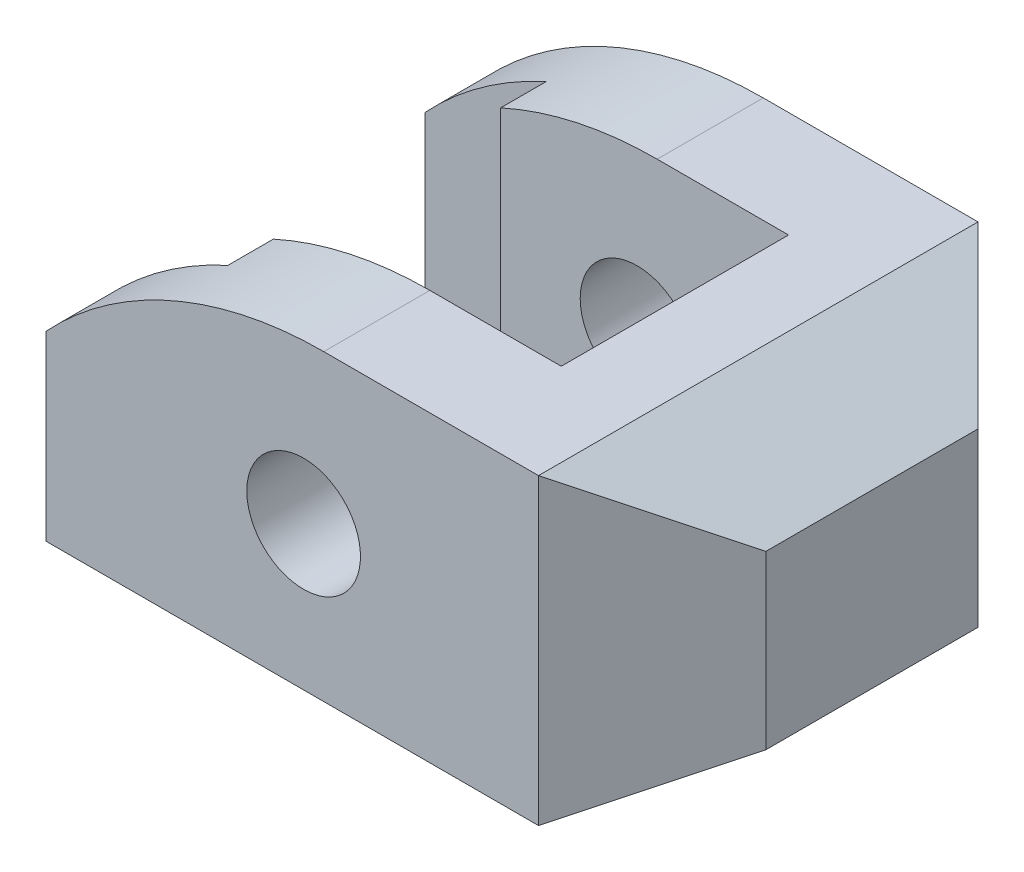
ISO-10303-21;
HEADER;
FILE_DESCRIPTION(('STEP AP214'),'2;1');
FILE_NAME('part.step','',(''),(''),'','','');
FILE_SCHEMA(('AUTOMOTIVE_DESIGN { 1 0 10303 214 1 1 1 1 }'));
ENDSEC;
DATA;
#1=APPLICATION_CONTEXT('core data for automotive mechanical design processes');
#2=APPLICATION_PROTOCOL_DEFINITION('international standard','automotive_design',2000,#1);
#3=PRODUCT_CONTEXT('',#1,'mechanical');
#4=PRODUCT('Part','Part','',(#3));
#5=PRODUCT_RELATED_PRODUCT_CATEGORY('part','',(#4));
#6=PRODUCT_DEFINITION_FORMATION('','',#4);
#7=PRODUCT_DEFINITION_CONTEXT('part definition',#1,'design');
#8=PRODUCT_DEFINITION('design','',#6,#7);
#9=PRODUCT_DEFINITION_SHAPE('','',#8);
#10=(LENGTH_UNIT() NAMED_UNIT(*) SI_UNIT(.MILLI.,.METRE.));
#11=(NAMED_UNIT(*) PLANE_ANGLE_UNIT() SI_UNIT($,.RADIAN.));
#12=(NAMED_UNIT(*) SI_UNIT($,.STERADIAN.) SOLID_ANGLE_UNIT());
#13=UNCERTAINTY_MEASURE_WITH_UNIT(LENGTH_MEASURE(1.E-05),#10,'distance_accuracy_value','');
#14=(GEOMETRIC_REPRESENTATION_CONTEXT(3) GLOBAL_UNCERTAINTY_ASSIGNED_CONTEXT((#13)) GLOBAL_UNIT_ASSIGNED_CONTEXT((#10,
#11,#12)) REPRESENTATION_CONTEXT('',''));
#15=CARTESIAN_POINT('',(0.,0.,0.));
#16=DIRECTION('',(0.,0.,1.));
#17=DIRECTION('',(1.,0.,0.));
#18=AXIS2_PLACEMENT_3D('',#15,#16,#17);
#19=CARTESIAN_POINT('',(36.6606055596467,-10.,58.));
#20=DIRECTION('',(0.,0.,1.));
#21=DIRECTION('',(1.,0.,0.));
#22=AXIS2_PLACEMENT_3D('',#19,#20,#21);
#23=PLANE('',#22);
#24=CARTESIAN_POINT('',(34.,19.,58.));
#25=DIRECTION('',(0.,0.,1.));
#26=DIRECTION('',(1.,0.,0.));
#27=AXIS2_PLACEMENT_3D('',#24,#25,#26);
#28=CIRCLE('',#27,7.5);
#29=CARTESIAN_POINT('',(26.5,19.,58.));
#30=VERTEX_POINT('',#29);
#31=EDGE_CURVE('E242',#30,#30,#28,.T.);
#32=ORIENTED_EDGE('',*,*,#31,.F.);
#33=EDGE_LOOP('',(#32));
#34=FACE_BOUND('',#33,.T.);
#35=DIRECTION('',(1.,0.,0.));
#36=VECTOR('',#35,1.);
#37=CARTESIAN_POINT('',(0.,0.,58.));
#38=LINE('',#37,#36);
#39=CARTESIAN_POINT('',(0.,0.,58.));
#40=VERTEX_POINT('',#39);
#41=CARTESIAN_POINT('',(65.,0.,58.));
#42=VERTEX_POINT('',#41);
#43=EDGE_CURVE('E222',#40,#42,#38,.T.);
#44=ORIENTED_EDGE('',*,*,#43,.T.);
#45=DIRECTION('',(0.,-1.,0.));
#46=VECTOR('',#45,1.);
#47=CARTESIAN_POINT('',(65.,40.,58.));
#48=LINE('',#47,#46);
#49=CARTESIAN_POINT('',(65.,40.,58.));
#50=VERTEX_POINT('',#49);
#51=EDGE_CURVE('E212',#50,#42,#48,.T.);
#52=ORIENTED_EDGE('',*,*,#51,.F.);
#53=DIRECTION('',(-1.,0.,0.));
#54=VECTOR('',#53,1.);
#55=CARTESIAN_POINT('',(65.,40.,58.));
#56=LINE('',#55,#54);
#57=CARTESIAN_POINT('',(36.6606055596467,40.,58.));
#58=VERTEX_POINT('',#57);
#59=EDGE_CURVE('E219',#50,#58,#56,.T.);
#60=ORIENTED_EDGE('',*,*,#59,.T.);
#61=CARTESIAN_POINT('',(36.6606055596467,-10.,58.));
#62=DIRECTION('',(0.,0.,1.));
#63=DIRECTION('',(1.,0.,0.));
#64=AXIS2_PLACEMENT_3D('',#61,#62,#63);
#65=CIRCLE('',#64,50.);
#66=CARTESIAN_POINT('',(0.,24.,58.));
#67=VERTEX_POINT('',#66);
#68=EDGE_CURVE('E234',#58,#67,#65,.T.);
#69=ORIENTED_EDGE('',*,*,#68,.T.);
#70=DIRECTION('',(0.,-1.,0.));
#71=VECTOR('',#70,1.);
#72=CARTESIAN_POINT('',(0.,0.,58.));
#73=LINE('',#72,#71);
#74=EDGE_CURVE('E238',#67,#40,#73,.T.);
#75=ORIENTED_EDGE('',*,*,#74,.T.);
#76=EDGE_LOOP('',(#44,#52,#60,#69,#75));
#77=FACE_BOUND('',#76,.T.);
#78=ADVANCED_FACE('F39',(#34,#77),#23,.T.);
#79=CARTESIAN_POINT('',(36.6606055596467,-10.,0.));
#80=DIRECTION('',(0.,0.,1.));
#81=DIRECTION('',(1.,0.,0.));
#82=AXIS2_PLACEMENT_3D('',#79,#80,#81);
#83=PLANE('',#82);
#84=CARTESIAN_POINT('',(34.,19.,0.));
#85=DIRECTION('',(0.,0.,1.));
#86=DIRECTION('',(1.,0.,0.));
#87=AXIS2_PLACEMENT_3D('',#84,#85,#86);
#88=CIRCLE('',#87,7.5);
#89=CARTESIAN_POINT('',(26.5,19.,0.));
#90=VERTEX_POINT('',#89);
#91=EDGE_CURVE('E303',#90,#90,#88,.T.);
#92=ORIENTED_EDGE('',*,*,#91,.T.);
#93=EDGE_LOOP('',(#92));
#94=FACE_BOUND('',#93,.T.);
#95=DIRECTION('',(0.,-1.,0.));
#96=VECTOR('',#95,1.);
#97=CARTESIAN_POINT('',(65.,40.,0.));
#98=LINE('',#97,#96);
#99=CARTESIAN_POINT('',(65.,40.,0.));
#100=VERTEX_POINT('',#99);
#101=CARTESIAN_POINT('',(65.,0.,0.));
#102=VERTEX_POINT('',#101);
#103=EDGE_CURVE('E153',#100,#102,#98,.T.);
#104=ORIENTED_EDGE('',*,*,#103,.T.);
#105=DIRECTION('',(1.,0.,0.));
#106=VECTOR('',#105,1.);
#107=CARTESIAN_POINT('',(0.,0.,0.));
#108=LINE('',#107,#106);
#109=CARTESIAN_POINT('',(0.,0.,0.));
#110=VERTEX_POINT('',#109);
#111=EDGE_CURVE('E170',#110,#102,#108,.T.);
#112=ORIENTED_EDGE('',*,*,#111,.F.);
#113=DIRECTION('',(0.,-1.,0.));
#114=VECTOR('',#113,1.);
#115=CARTESIAN_POINT('',(0.,0.,0.));
#116=LINE('',#115,#114);
#117=CARTESIAN_POINT('',(0.,24.,0.));
#118=VERTEX_POINT('',#117);
#119=EDGE_CURVE('E184',#118,#110,#116,.T.);
#120=ORIENTED_EDGE('',*,*,#119,.F.);
#121=CARTESIAN_POINT('',(36.6606055596467,-10.,0.));
#122=DIRECTION('',(0.,0.,1.));
#123=DIRECTION('',(1.,0.,0.));
#124=AXIS2_PLACEMENT_3D('',#121,#122,#123);
#125=CIRCLE('',#124,50.);
#126=CARTESIAN_POINT('',(36.6606055596467,40.,0.));
#127=VERTEX_POINT('',#126);
#128=EDGE_CURVE('E245',#127,#118,#125,.T.);
#129=ORIENTED_EDGE('',*,*,#128,.F.);
#130=DIRECTION('',(-1.,0.,0.));
#131=VECTOR('',#130,1.);
#132=CARTESIAN_POINT('',(65.,40.,0.));
#133=LINE('',#132,#131);
#134=EDGE_CURVE('E174',#100,#127,#133,.T.);
#135=ORIENTED_EDGE('',*,*,#134,.F.);
#136=EDGE_LOOP('',(#104,#112,#120,#129,#135));
#137=FACE_BOUND('',#136,.T.);
#138=ADVANCED_FACE('F168',(#94,#137),#83,.F.);
#139=CARTESIAN_POINT('',(65.,0.,58.));
#140=DIRECTION('',(-0.500000000000001,0.866025403784438,0.));
#141=DIRECTION('',(-0.866025403784438,-0.500000000000001,0.));
#142=AXIS2_PLACEMENT_3D('',#139,#140,#141);
#143=PLANE('',#142);
#144=DIRECTION('',(-0.654653670707984,-0.377964473009232,-0.654653670707968));
#145=VECTOR('',#144,1.);
#146=CARTESIAN_POINT('',(89.8571428571428,14.3512781198564,24.8571428571421));
#147=LINE('',#146,#145);
#148=CARTESIAN_POINT('',(80.,8.66025403784441,14.9999999999996));
#149=VERTEX_POINT('',#148);
#150=EDGE_CURVE('E150',#149,#102,#147,.T.);
#151=ORIENTED_EDGE('',*,*,#150,.F.);
#152=DIRECTION('',(0.,0.,-1.));
#153=VECTOR('',#152,1.);
#154=CARTESIAN_POINT('',(80.,8.66025403784441,58.));
#155=LINE('',#154,#153);
#156=CARTESIAN_POINT('',(80.,8.66025403784441,43.0000000000002));
#157=VERTEX_POINT('',#156);
#158=EDGE_CURVE('E189',#157,#149,#155,.T.);
#159=ORIENTED_EDGE('',*,*,#158,.F.);
#160=DIRECTION('',(0.65465367070798,0.37796447300923,-0.654653670707973));
#161=VECTOR('',#160,1.);
#162=CARTESIAN_POINT('',(65.,0.,58.));
#163=LINE('',#162,#161);
#164=EDGE_CURVE('E162',#42,#157,#163,.T.);
#165=ORIENTED_EDGE('',*,*,#164,.F.);
#166=DIRECTION('',(0.,0.,-1.));
#167=VECTOR('',#166,1.);
#168=CARTESIAN_POINT('',(65.,0.,58.));
#169=LINE('',#168,#167);
#170=EDGE_CURVE('E180',#42,#102,#169,.T.);
#171=ORIENTED_EDGE('',*,*,#170,.T.);
#172=EDGE_LOOP('',(#151,#159,#165,#171));
#173=FACE_BOUND('',#172,.T.);
#174=ADVANCED_FACE('F187',(#173),#143,.F.);
#175=CARTESIAN_POINT('',(80.,8.66025403784441,58.));
#176=DIRECTION('',(-1.,0.,0.));
#177=DIRECTION('',(0.,0.,1.));
#178=AXIS2_PLACEMENT_3D('',#175,#176,#177);
#179=PLANE('',#178);
#180=DIRECTION('',(0.,-1.,0.));
#181=VECTOR('',#180,1.);
#182=CARTESIAN_POINT('',(80.,40.,14.9999999999996));
#183=LINE('',#182,#181);
#184=CARTESIAN_POINT('',(80.,31.3397459621556,14.9999999999996));
#185=VERTEX_POINT('',#184);
#186=EDGE_CURVE('E156',#185,#149,#183,.T.);
#187=ORIENTED_EDGE('',*,*,#186,.F.);
#188=DIRECTION('',(0.,0.,-1.));
#189=VECTOR('',#188,1.);
#190=CARTESIAN_POINT('',(80.,31.3397459621556,58.));
#191=LINE('',#190,#189);
#192=CARTESIAN_POINT('',(80.,31.3397459621556,43.0000000000002));
#193=VERTEX_POINT('',#192);
#194=EDGE_CURVE('E193',#193,#185,#191,.T.);
#195=ORIENTED_EDGE('',*,*,#194,.F.);
#196=DIRECTION('',(0.,-1.,0.));
#197=VECTOR('',#196,1.);
#198=CARTESIAN_POINT('',(80.,40.,43.0000000000002));
#199=LINE('',#198,#197);
#200=EDGE_CURVE('E54',#193,#157,#199,.T.);
#201=ORIENTED_EDGE('',*,*,#200,.T.);
#202=ORIENTED_EDGE('',*,*,#158,.T.);
#203=EDGE_LOOP('',(#187,#195,#201,#202));
#204=FACE_BOUND('',#203,.T.);
#205=ADVANCED_FACE('F253',(#204),#179,.F.);
#206=CARTESIAN_POINT('',(80.,31.3397459621556,58.));
#207=DIRECTION('',(-0.500000000000001,-0.866025403784438,0.));
#208=DIRECTION('',(0.866025403784438,-0.500000000000001,0.));
#209=AXIS2_PLACEMENT_3D('',#206,#207,#208);
#210=PLANE('',#209);
#211=DIRECTION('',(0.654653670707984,-0.377964473009232,0.654653670707968));
#212=VECTOR('',#211,1.);
#213=CARTESIAN_POINT('',(98.4285714285715,20.7000052870895,33.4285714285707));
#214=LINE('',#213,#212);
#215=EDGE_CURVE('E11',#100,#185,#214,.T.);
#216=ORIENTED_EDGE('',*,*,#215,.F.);
#217=DIRECTION('',(0.,0.,-1.));
#218=VECTOR('',#217,1.);
#219=CARTESIAN_POINT('',(65.,40.,58.));
#220=LINE('',#219,#218);
#221=EDGE_CURVE('E225',#50,#100,#220,.T.);
#222=ORIENTED_EDGE('',*,*,#221,.F.);
#223=DIRECTION('',(-0.65465367070798,0.37796447300923,0.654653670707973));
#224=VECTOR('',#223,1.);
#225=CARTESIAN_POINT('',(73.5714285714287,35.051283406946,49.4285714285714));
#226=LINE('',#225,#224);
#227=EDGE_CURVE('E47',#193,#50,#226,.T.);
#228=ORIENTED_EDGE('',*,*,#227,.F.);
#229=ORIENTED_EDGE('',*,*,#194,.T.);
#230=EDGE_LOOP('',(#216,#222,#228,#229));
#231=FACE_BOUND('',#230,.T.);
#232=ADVANCED_FACE('F226',(#231),#210,.F.);
#233=CARTESIAN_POINT('',(0.,0.,58.));
#234=DIRECTION('',(0.,1.,0.));
#235=DIRECTION('',(0.,0.,1.));
#236=AXIS2_PLACEMENT_3D('',#233,#234,#235);
#237=PLANE('',#236);
#238=DIRECTION('',(1.,0.,0.));
#239=VECTOR('',#238,1.);
#240=CARTESIAN_POINT('',(16.,0.,44.));
#241=LINE('',#240,#239);
#242=CARTESIAN_POINT('',(16.,0.,44.));
#243=VERTEX_POINT('',#242);
#244=CARTESIAN_POINT('',(54.,0.,44.));
#245=VERTEX_POINT('',#244);
#246=EDGE_CURVE('E161',#243,#245,#241,.T.);
#247=ORIENTED_EDGE('',*,*,#246,.T.);
#248=DIRECTION('',(0.,0.,-1.));
#249=VECTOR('',#248,1.);
#250=CARTESIAN_POINT('',(54.,0.,14.));
#251=LINE('',#250,#249);
#252=CARTESIAN_POINT('',(54.,0.,14.));
#253=VERTEX_POINT('',#252);
#254=EDGE_CURVE('E267',#245,#253,#251,.T.);
#255=ORIENTED_EDGE('',*,*,#254,.T.);
#256=DIRECTION('',(-1.,0.,0.));
#257=VECTOR('',#256,1.);
#258=CARTESIAN_POINT('',(16.,0.,14.));
#259=LINE('',#258,#257);
#260=CARTESIAN_POINT('',(16.,0.,14.));
#261=VERTEX_POINT('',#260);
#262=EDGE_CURVE('E261',#253,#261,#259,.T.);
#263=ORIENTED_EDGE('',*,*,#262,.T.);
#264=DIRECTION('',(0.,0.,-1.));
#265=VECTOR('',#264,1.);
#266=CARTESIAN_POINT('',(16.,0.,8.));
#267=LINE('',#266,#265);
#268=CARTESIAN_POINT('',(16.,0.,8.));
#269=VERTEX_POINT('',#268);
#270=EDGE_CURVE('E287',#261,#269,#267,.T.);
#271=ORIENTED_EDGE('',*,*,#270,.T.);
#272=DIRECTION('',(-1.,0.,0.));
#273=VECTOR('',#272,1.);
#274=CARTESIAN_POINT('',(0.,0.,8.));
#275=LINE('',#274,#273);
#276=CARTESIAN_POINT('',(0.,0.,8.));
#277=VERTEX_POINT('',#276);
#278=EDGE_CURVE('E291',#269,#277,#275,.T.);
#279=ORIENTED_EDGE('',*,*,#278,.T.);
#280=DIRECTION('',(0.,0.,-1.));
#281=VECTOR('',#280,1.);
#282=CARTESIAN_POINT('',(0.,0.,58.));
#283=LINE('',#282,#281);
#284=EDGE_CURVE('E183',#277,#110,#283,.T.);
#285=ORIENTED_EDGE('',*,*,#284,.T.);
#286=ORIENTED_EDGE('',*,*,#111,.T.);
#287=ORIENTED_EDGE('',*,*,#170,.F.);
#288=ORIENTED_EDGE('',*,*,#43,.F.);
#289=CARTESIAN_POINT('',(0.,0.,50.));
#290=VERTEX_POINT('',#289);
#291=EDGE_CURVE('E191',#40,#290,#283,.T.);
#292=ORIENTED_EDGE('',*,*,#291,.T.);
#293=DIRECTION('',(1.,0.,0.));
#294=VECTOR('',#293,1.);
#295=CARTESIAN_POINT('',(0.,0.,50.));
#296=LINE('',#295,#294);
#297=CARTESIAN_POINT('',(16.,0.,50.));
#298=VERTEX_POINT('',#297);
#299=EDGE_CURVE('E284',#290,#298,#296,.T.);
#300=ORIENTED_EDGE('',*,*,#299,.T.);
#301=EDGE_CURVE('E288',#298,#243,#267,.T.);
#302=ORIENTED_EDGE('',*,*,#301,.T.);
#303=EDGE_LOOP('',(#247,#255,#263,#271,#279,#285,#286,#287,#288,#292,#300,#302));
#304=FACE_BOUND('',#303,.T.);
#305=ADVANCED_FACE('F179',(#304),#237,.F.);
#306=CARTESIAN_POINT('',(36.6606055596467,-10.,58.));
#307=DIRECTION('',(0.,0.,-1.));
#308=DIRECTION('',(-1.,0.,0.));
#309=AXIS2_PLACEMENT_3D('',#306,#307,#308);
#310=CYLINDRICAL_SURFACE('',#309,50.);
#311=CARTESIAN_POINT('',(36.6606055596467,-10.,44.));
#312=DIRECTION('',(0.,0.,-1.));
#313=DIRECTION('',(-1.,0.,0.));
#314=AXIS2_PLACEMENT_3D('',#311,#312,#313);
#315=CIRCLE('',#314,50.);
#316=CARTESIAN_POINT('',(16.,35.5317403347236,44.));
#317=VERTEX_POINT('',#316);
#318=CARTESIAN_POINT('',(36.6606055596467,40.,44.));
#319=VERTEX_POINT('',#318);
#320=EDGE_CURVE('E282',#317,#319,#315,.T.);
#321=ORIENTED_EDGE('',*,*,#320,.F.);
#322=DIRECTION('',(0.,0.,-1.));
#323=VECTOR('',#322,1.);
#324=CARTESIAN_POINT('',(16.,35.5317403347236,58.));
#325=LINE('',#324,#323);
#326=CARTESIAN_POINT('',(16.,35.5317403347236,50.));
#327=VERTEX_POINT('',#326);
#328=EDGE_CURVE('E201',#327,#317,#325,.T.);
#329=ORIENTED_EDGE('',*,*,#328,.F.);
#330=CARTESIAN_POINT('',(36.6606055596467,-10.,50.));
#331=DIRECTION('',(0.,0.,-1.));
#332=DIRECTION('',(-1.,0.,0.));
#333=AXIS2_PLACEMENT_3D('',#330,#331,#332);
#334=CIRCLE('',#333,50.);
#335=CARTESIAN_POINT('',(0.,24.,50.));
#336=VERTEX_POINT('',#335);
#337=EDGE_CURVE('E204',#336,#327,#334,.T.);
#338=ORIENTED_EDGE('',*,*,#337,.F.);
#339=DIRECTION('',(0.,0.,-1.));
#340=VECTOR('',#339,1.);
#341=CARTESIAN_POINT('',(0.,24.,58.));
#342=LINE('',#341,#340);
#343=EDGE_CURVE('E248',#67,#336,#342,.T.);
#344=ORIENTED_EDGE('',*,*,#343,.F.);
#345=ORIENTED_EDGE('',*,*,#68,.F.);
#346=DIRECTION('',(0.,0.,-1.));
#347=VECTOR('',#346,1.);
#348=CARTESIAN_POINT('',(36.6606055596467,40.,58.));
#349=LINE('',#348,#347);
#350=EDGE_CURVE('E228',#58,#319,#349,.T.);
#351=ORIENTED_EDGE('',*,*,#350,.T.);
#352=EDGE_LOOP('',(#321,#329,#338,#344,#345,#351));
#353=FACE_BOUND('',#352,.T.);
#354=ADVANCED_FACE('F323',(#353),#310,.T.);
#355=CARTESIAN_POINT('',(36.6606055596467,-10.,14.));
#356=DIRECTION('',(0.,0.,1.));
#357=DIRECTION('',(1.,0.,0.));
#358=AXIS2_PLACEMENT_3D('',#355,#356,#357);
#359=CIRCLE('',#358,50.);
#360=CARTESIAN_POINT('',(36.6606055596467,40.,14.));
#361=VERTEX_POINT('',#360);
#362=CARTESIAN_POINT('',(16.,35.5317403347236,14.));
#363=VERTEX_POINT('',#362);
#364=EDGE_CURVE('E62',#361,#363,#359,.T.);
#365=ORIENTED_EDGE('',*,*,#364,.F.);
#366=EDGE_CURVE('E251',#361,#127,#349,.T.);
#367=ORIENTED_EDGE('',*,*,#366,.T.);
#368=ORIENTED_EDGE('',*,*,#128,.T.);
#369=CARTESIAN_POINT('',(0.,24.,8.));
#370=VERTEX_POINT('',#369);
#371=EDGE_CURVE('E236',#370,#118,#342,.T.);
#372=ORIENTED_EDGE('',*,*,#371,.F.);
#373=CARTESIAN_POINT('',(36.6606055596467,-10.,8.));
#374=DIRECTION('',(0.,0.,1.));
#375=DIRECTION('',(1.,0.,0.));
#376=AXIS2_PLACEMENT_3D('',#373,#374,#375);
#377=CIRCLE('',#376,50.);
#378=CARTESIAN_POINT('',(16.,35.5317403347236,8.));
#379=VERTEX_POINT('',#378);
#380=EDGE_CURVE('E198',#379,#370,#377,.T.);
#381=ORIENTED_EDGE('',*,*,#380,.F.);
#382=EDGE_CURVE('E200',#363,#379,#325,.T.);
#383=ORIENTED_EDGE('',*,*,#382,.F.);
#384=EDGE_LOOP('',(#365,#367,#368,#372,#381,#383));
#385=FACE_BOUND('',#384,.T.);
#386=ADVANCED_FACE('F325',(#385),#310,.T.);
#387=CARTESIAN_POINT('',(65.,40.,58.));
#388=DIRECTION('',(0.,-1.,0.));
#389=DIRECTION('',(1.,0.,0.));
#390=AXIS2_PLACEMENT_3D('',#387,#388,#389);
#391=PLANE('',#390);
#392=DIRECTION('',(1.,0.,0.));
#393=VECTOR('',#392,1.);
#394=CARTESIAN_POINT('',(16.,40.,44.));
#395=LINE('',#394,#393);
#396=CARTESIAN_POINT('',(54.,40.,44.));
#397=VERTEX_POINT('',#396);
#398=EDGE_CURVE('E258',#319,#397,#395,.T.);
#399=ORIENTED_EDGE('',*,*,#398,.F.);
#400=ORIENTED_EDGE('',*,*,#350,.F.);
#401=ORIENTED_EDGE('',*,*,#59,.F.);
#402=ORIENTED_EDGE('',*,*,#221,.T.);
#403=ORIENTED_EDGE('',*,*,#134,.T.);
#404=ORIENTED_EDGE('',*,*,#366,.F.);
#405=DIRECTION('',(-1.,0.,0.));
#406=VECTOR('',#405,1.);
#407=CARTESIAN_POINT('',(16.,40.,14.));
#408=LINE('',#407,#406);
#409=CARTESIAN_POINT('',(54.,40.,14.));
#410=VERTEX_POINT('',#409);
#411=EDGE_CURVE('E263',#410,#361,#408,.T.);
#412=ORIENTED_EDGE('',*,*,#411,.F.);
#413=DIRECTION('',(0.,0.,-1.));
#414=VECTOR('',#413,1.);
#415=CARTESIAN_POINT('',(54.,40.,14.));
#416=LINE('',#415,#414);
#417=EDGE_CURVE('E260',#397,#410,#416,.T.);
#418=ORIENTED_EDGE('',*,*,#417,.F.);
#419=EDGE_LOOP('',(#399,#400,#401,#402,#403,#404,#412,#418));
#420=FACE_BOUND('',#419,.T.);
#421=ADVANCED_FACE('F231',(#420),#391,.F.);
#422=CARTESIAN_POINT('',(34.,19.,58.));
#423=DIRECTION('',(0.,0.,-1.));
#424=DIRECTION('',(-1.,0.,0.));
#425=AXIS2_PLACEMENT_3D('',#422,#423,#424);
#426=CYLINDRICAL_SURFACE('',#425,7.5);
#427=CARTESIAN_POINT('',(34.,19.,44.));
#428=DIRECTION('',(0.,0.,-1.));
#429=DIRECTION('',(-1.,0.,0.));
#430=AXIS2_PLACEMENT_3D('',#427,#428,#429);
#431=CIRCLE('',#430,7.5);
#432=CARTESIAN_POINT('',(26.5,19.,44.));
#433=VERTEX_POINT('',#432);
#434=EDGE_CURVE('E279',#433,#433,#431,.T.);
#435=CARTESIAN_POINT('',(26.5,19.,58.));
#436=CARTESIAN_POINT('',(26.5,19.,57.8541666666667));
#437=CARTESIAN_POINT('',(26.5,19.,57.7083333333333));
#438=CARTESIAN_POINT('',(26.5,19.,57.4166666666667));
#439=CARTESIAN_POINT('',(26.5,19.,57.2708333333333));
#440=CARTESIAN_POINT('',(26.5,19.,56.9791666666667));
#441=CARTESIAN_POINT('',(26.5,19.,56.8333333333333));
#442=CARTESIAN_POINT('',(26.5,19.,56.5416666666667));
#443=CARTESIAN_POINT('',(26.5,19.,56.3958333333333));
#444=CARTESIAN_POINT('',(26.5,19.,56.1041666666667));
#445=CARTESIAN_POINT('',(26.5,19.,55.9583333333333));
#446=CARTESIAN_POINT('',(26.5,19.,55.6666666666667));
#447=CARTESIAN_POINT('',(26.5,19.,55.5208333333333));
#448=CARTESIAN_POINT('',(26.5,19.,55.2291666666667));
#449=CARTESIAN_POINT('',(26.5,19.,55.0833333333333));
#450=CARTESIAN_POINT('',(26.5,19.,54.7916666666667));
#451=CARTESIAN_POINT('',(26.5,19.,54.6458333333333));
#452=CARTESIAN_POINT('',(26.5,19.,54.3541666666667));
#453=CARTESIAN_POINT('',(26.5,19.,54.2083333333333));
#454=CARTESIAN_POINT('',(26.5,19.,53.9166666666667));
#455=CARTESIAN_POINT('',(26.5,19.,53.7708333333333));
#456=CARTESIAN_POINT('',(26.5,19.,53.4791666666667));
#457=CARTESIAN_POINT('',(26.5,19.,53.3333333333333));
#458=CARTESIAN_POINT('',(26.5,19.,53.0416666666667));
#459=CARTESIAN_POINT('',(26.5,19.,52.8958333333333));
#460=CARTESIAN_POINT('',(26.5,19.,52.6041666666667));
#461=CARTESIAN_POINT('',(26.5,19.,52.4583333333333));
#462=CARTESIAN_POINT('',(26.5,19.,52.1666666666667));
#463=CARTESIAN_POINT('',(26.5,19.,52.0208333333333));
#464=CARTESIAN_POINT('',(26.5,19.,51.7291666666667));
#465=CARTESIAN_POINT('',(26.5,19.,51.5833333333333));
#466=CARTESIAN_POINT('',(26.5,19.,51.2916666666667));
#467=CARTESIAN_POINT('',(26.5,19.,51.1458333333333));
#468=CARTESIAN_POINT('',(26.5,19.,50.8541666666667));
#469=CARTESIAN_POINT('',(26.5,19.,50.7083333333333));
#470=CARTESIAN_POINT('',(26.5,19.,50.4166666666667));
#471=CARTESIAN_POINT('',(26.5,19.,50.2708333333333));
#472=CARTESIAN_POINT('',(26.5,19.,49.9791666666667));
#473=CARTESIAN_POINT('',(26.5,19.,49.8333333333333));
#474=CARTESIAN_POINT('',(26.5,19.,49.5416666666667));
#475=CARTESIAN_POINT('',(26.5,19.,49.3958333333333));
#476=CARTESIAN_POINT('',(26.5,19.,49.1041666666667));
#477=CARTESIAN_POINT('',(26.5,19.,48.9583333333333));
#478=CARTESIAN_POINT('',(26.5,19.,48.6666666666667));
#479=CARTESIAN_POINT('',(26.5,19.,48.5208333333333));
#480=CARTESIAN_POINT('',(26.5,19.,48.2291666666667));
#481=CARTESIAN_POINT('',(26.5,19.,48.0833333333333));
#482=CARTESIAN_POINT('',(26.5,19.,47.7916666666667));
#483=CARTESIAN_POINT('',(26.5,19.,47.6458333333333));
#484=CARTESIAN_POINT('',(26.5,19.,47.3541666666667));
#485=CARTESIAN_POINT('',(26.5,19.,47.2083333333333));
#486=CARTESIAN_POINT('',(26.5,19.,46.9166666666667));
#487=CARTESIAN_POINT('',(26.5,19.,46.7708333333333));
#488=CARTESIAN_POINT('',(26.5,19.,46.4791666666667));
#489=CARTESIAN_POINT('',(26.5,19.,46.3333333333333));
#490=CARTESIAN_POINT('',(26.5,19.,46.0416666666667));
#491=CARTESIAN_POINT('',(26.5,19.,45.8958333333333));
#492=CARTESIAN_POINT('',(26.5,19.,45.6041666666667));
#493=CARTESIAN_POINT('',(26.5,19.,45.4583333333333));
#494=CARTESIAN_POINT('',(26.5,19.,45.1666666666667));
#495=CARTESIAN_POINT('',(26.5,19.,45.0208333333333));
#496=CARTESIAN_POINT('',(26.5,19.,44.7291666666667));
#497=CARTESIAN_POINT('',(26.5,19.,44.5833333333333));
#498=CARTESIAN_POINT('',(26.5,19.,44.2916666666667));
#499=CARTESIAN_POINT('',(26.5,19.,44.1458333333333));
#500=CARTESIAN_POINT('',(26.5,19.,44.));
#501=B_SPLINE_CURVE_WITH_KNOTS('',3,(#435,#436,#437,#438,#439,#440,#441,#442,#443,#444,#445,
#446,#447,#448,#449,#450,#451,#452,#453,#454,#455,#456,#457,#458,#459,#460,#461,#462,#463,#464,
#465,#466,#467,#468,#469,#470,#471,#472,#473,#474,#475,#476,#477,#478,#479,#480,#481,#482,#483,
#484,#485,#486,#487,#488,#489,#490,#491,#492,#493,#494,#495,#496,#497,#498,#499,#500),
.UNSPECIFIED.,.F.,.F.,(4,2,2,2,2,2,2,2,2,2,2,2,2,2,2,2,2,2,2,2,2,2,2,2,2,2,2,2,2,2,2,2,4),(0.,
0.437499999999993,0.874999999999994,1.31249999999999,1.74999999999999,2.1875,2.625,3.0625,3.5,
3.9375,4.375,4.8125,5.24999999999999,5.68749999999999,6.12499999999999,6.56249999999999,
6.99999999999999,7.43749999999999,7.87499999999999,8.31249999999999,8.74999999999999,
9.18749999999999,9.62499999999999,10.0625,10.5,10.9375,11.375,11.8125,12.25,12.6875,13.125,
13.5625,14.),.UNSPECIFIED.);
#502=EDGE_CURVE('BSEAM345',#30,#433,#501,.T.);
#503=ORIENTED_EDGE('',*,*,#31,.T.);
#504=ORIENTED_EDGE('',*,*,#434,.T.);
#505=ORIENTED_EDGE('',*,*,#502,.T.);
#506=ORIENTED_EDGE('',*,*,#502,.F.);
#507=EDGE_LOOP('',(#503,#505,#504,#506));
#508=FACE_BOUND('',#507,.T.);
#509=ADVANCED_FACE('F345',(#508),#426,.F.);
#510=CARTESIAN_POINT('',(34.,19.,14.));
#511=DIRECTION('',(0.,0.,1.));
#512=DIRECTION('',(1.,0.,0.));
#513=AXIS2_PLACEMENT_3D('',#510,#511,#512);
#514=CIRCLE('',#513,7.5);
#515=CARTESIAN_POINT('',(26.5,19.,14.));
#516=VERTEX_POINT('',#515);
#517=EDGE_CURVE('E275',#516,#516,#514,.T.);
#518=CARTESIAN_POINT('',(26.5,19.,0.));
#519=CARTESIAN_POINT('',(26.5,19.,0.145833333333333));
#520=CARTESIAN_POINT('',(26.5,19.,0.291666666666667));
#521=CARTESIAN_POINT('',(26.5,19.,0.583333333333334));
#522=CARTESIAN_POINT('',(26.5,19.,0.729166666666667));
#523=CARTESIAN_POINT('',(26.5,19.,1.02083333333333));
#524=CARTESIAN_POINT('',(26.5,19.,1.16666666666667));
#525=CARTESIAN_POINT('',(26.5,19.,1.45833333333333));
#526=CARTESIAN_POINT('',(26.5,19.,1.60416666666667));
#527=CARTESIAN_POINT('',(26.5,19.,1.89583333333334));
#528=CARTESIAN_POINT('',(26.5,19.,2.04166666666667));
#529=CARTESIAN_POINT('',(26.5,19.,2.33333333333334));
#530=CARTESIAN_POINT('',(26.5,19.,2.47916666666667));
#531=CARTESIAN_POINT('',(26.5,19.,2.77083333333334));
#532=CARTESIAN_POINT('',(26.5,19.,2.91666666666667));
#533=CARTESIAN_POINT('',(26.5,19.,3.20833333333334));
#534=CARTESIAN_POINT('',(26.5,19.,3.35416666666667));
#535=CARTESIAN_POINT('',(26.5,19.,3.64583333333333));
#536=CARTESIAN_POINT('',(26.5,19.,3.79166666666667));
#537=CARTESIAN_POINT('',(26.5,19.,4.08333333333333));
#538=CARTESIAN_POINT('',(26.5,19.,4.22916666666666));
#539=CARTESIAN_POINT('',(26.5,19.,4.52083333333333));
#540=CARTESIAN_POINT('',(26.5,19.,4.66666666666666));
#541=CARTESIAN_POINT('',(26.5,19.,4.95833333333333));
#542=CARTESIAN_POINT('',(26.5,19.,5.10416666666666));
#543=CARTESIAN_POINT('',(26.5,19.,5.39583333333333));
#544=CARTESIAN_POINT('',(26.5,19.,5.54166666666666));
#545=CARTESIAN_POINT('',(26.5,19.,5.83333333333333));
#546=CARTESIAN_POINT('',(26.5,19.,5.97916666666667));
#547=CARTESIAN_POINT('',(26.5,19.,6.27083333333333));
#548=CARTESIAN_POINT('',(26.5,19.,6.41666666666667));
#549=CARTESIAN_POINT('',(26.5,19.,6.70833333333333));
#550=CARTESIAN_POINT('',(26.5,19.,6.85416666666667));
#551=CARTESIAN_POINT('',(26.5,19.,7.14583333333333));
#552=CARTESIAN_POINT('',(26.5,19.,7.29166666666667));
#553=CARTESIAN_POINT('',(26.5,19.,7.58333333333333));
#554=CARTESIAN_POINT('',(26.5,19.,7.72916666666667));
#555=CARTESIAN_POINT('',(26.5,19.,8.02083333333333));
#556=CARTESIAN_POINT('',(26.5,19.,8.16666666666667));
#557=CARTESIAN_POINT('',(26.5,19.,8.45833333333333));
#558=CARTESIAN_POINT('',(26.5,19.,8.60416666666667));
#559=CARTESIAN_POINT('',(26.5,19.,8.89583333333333));
#560=CARTESIAN_POINT('',(26.5,19.,9.04166666666667));
#561=CARTESIAN_POINT('',(26.5,19.,9.33333333333333));
#562=CARTESIAN_POINT('',(26.5,19.,9.47916666666666));
#563=CARTESIAN_POINT('',(26.5,19.,9.77083333333333));
#564=CARTESIAN_POINT('',(26.5,19.,9.91666666666667));
#565=CARTESIAN_POINT('',(26.5,19.,10.2083333333333));
#566=CARTESIAN_POINT('',(26.5,19.,10.3541666666667));
#567=CARTESIAN_POINT('',(26.5,19.,10.6458333333333));
#568=CARTESIAN_POINT('',(26.5,19.,10.7916666666667));
#569=CARTESIAN_POINT('',(26.5,19.,11.0833333333333));
#570=CARTESIAN_POINT('',(26.5,19.,11.2291666666667));
#571=CARTESIAN_POINT('',(26.5,19.,11.5208333333333));
#572=CARTESIAN_POINT('',(26.5,19.,11.6666666666667));
#573=CARTESIAN_POINT('',(26.5,19.,11.9583333333333));
#574=CARTESIAN_POINT('',(26.5,19.,12.1041666666667));
#575=CARTESIAN_POINT('',(26.5,19.,12.3958333333333));
#576=CARTESIAN_POINT('',(26.5,19.,12.5416666666667));
#577=CARTESIAN_POINT('',(26.5,19.,12.8333333333333));
#578=CARTESIAN_POINT('',(26.5,19.,12.9791666666667));
#579=CARTESIAN_POINT('',(26.5,19.,13.2708333333333));
#580=CARTESIAN_POINT('',(26.5,19.,13.4166666666667));
#581=CARTESIAN_POINT('',(26.5,19.,13.7083333333333));
#582=CARTESIAN_POINT('',(26.5,19.,13.8541666666667));
#583=CARTESIAN_POINT('',(26.5,19.,14.));
#584=B_SPLINE_CURVE_WITH_KNOTS('',3,(#518,#519,#520,#521,#522,#523,#524,#525,#526,#527,#528,
#529,#530,#531,#532,#533,#534,#535,#536,#537,#538,#539,#540,#541,#542,#543,#544,#545,#546,#547,
#548,#549,#550,#551,#552,#553,#554,#555,#556,#557,#558,#559,#560,#561,#562,#563,#564,#565,#566,
#567,#568,#569,#570,#571,#572,#573,#574,#575,#576,#577,#578,#579,#580,#581,#582,#583),
.UNSPECIFIED.,.F.,.F.,(4,2,2,2,2,2,2,2,2,2,2,2,2,2,2,2,2,2,2,2,2,2,2,2,2,2,2,2,2,2,2,2,4),(0.,
0.4375,0.875000000000001,1.3125,1.75,2.1875,2.625,3.0625,3.5,3.9375,4.375,4.8125,5.25,5.6875,
6.125,6.5625,7.,7.4375,7.875,8.3125,8.75,9.1875,9.62499999999999,10.0625,10.5,10.9375,11.375,
11.8125,12.25,12.6875,13.125,13.5625,14.),.UNSPECIFIED.);
#585=EDGE_CURVE('BSEAM348',#90,#516,#584,.T.);
#586=ORIENTED_EDGE('',*,*,#91,.F.);
#587=ORIENTED_EDGE('',*,*,#517,.T.);
#588=ORIENTED_EDGE('',*,*,#585,.T.);
#589=ORIENTED_EDGE('',*,*,#585,.F.);
#590=EDGE_LOOP('',(#586,#588,#587,#589));
#591=FACE_BOUND('',#590,.T.);
#592=ADVANCED_FACE('F348',(#591),#426,.F.);
#593=CARTESIAN_POINT('',(16.,40.,8.));
#594=DIRECTION('',(-1.,0.,0.));
#595=DIRECTION('',(0.,0.,1.));
#596=AXIS2_PLACEMENT_3D('',#593,#594,#595);
#597=PLANE('',#596);
#598=ORIENTED_EDGE('',*,*,#328,.T.);
#599=DIRECTION('',(0.,-1.,0.));
#600=VECTOR('',#599,1.);
#601=CARTESIAN_POINT('',(16.,40.,44.));
#602=LINE('',#601,#600);
#603=EDGE_CURVE('E208',#317,#243,#602,.T.);
#604=ORIENTED_EDGE('',*,*,#603,.T.);
#605=ORIENTED_EDGE('',*,*,#301,.F.);
#606=DIRECTION('',(0.,-1.,0.));
#607=VECTOR('',#606,1.);
#608=CARTESIAN_POINT('',(16.,40.,50.));
#609=LINE('',#608,#607);
#610=EDGE_CURVE('E298',#327,#298,#609,.T.);
#611=ORIENTED_EDGE('',*,*,#610,.F.);
#612=EDGE_LOOP('',(#598,#604,#605,#611));
#613=FACE_BOUND('',#612,.T.);
#614=ADVANCED_FACE('F318',(#613),#597,.T.);
#615=ORIENTED_EDGE('',*,*,#270,.F.);
#616=DIRECTION('',(0.,1.,0.));
#617=VECTOR('',#616,1.);
#618=CARTESIAN_POINT('',(16.,40.,14.));
#619=LINE('',#618,#617);
#620=EDGE_CURVE('E206',#261,#363,#619,.T.);
#621=ORIENTED_EDGE('',*,*,#620,.T.);
#622=ORIENTED_EDGE('',*,*,#382,.T.);
#623=DIRECTION('',(0.,-1.,0.));
#624=VECTOR('',#623,1.);
#625=CARTESIAN_POINT('',(16.,40.,8.));
#626=LINE('',#625,#624);
#627=EDGE_CURVE('E295',#379,#269,#626,.T.);
#628=ORIENTED_EDGE('',*,*,#627,.T.);
#629=EDGE_LOOP('',(#615,#621,#622,#628));
#630=FACE_BOUND('',#629,.T.);
#631=ADVANCED_FACE('F356',(#630),#597,.T.);
#632=CARTESIAN_POINT('',(0.,0.,58.));
#633=DIRECTION('',(1.,0.,0.));
#634=DIRECTION('',(0.,0.,-1.));
#635=AXIS2_PLACEMENT_3D('',#632,#633,#634);
#636=PLANE('',#635);
#637=DIRECTION('',(0.,-1.,0.));
#638=VECTOR('',#637,1.);
#639=CARTESIAN_POINT('',(0.,40.,50.));
#640=LINE('',#639,#638);
#641=EDGE_CURVE('E300',#336,#290,#640,.T.);
#642=ORIENTED_EDGE('',*,*,#641,.T.);
#643=ORIENTED_EDGE('',*,*,#291,.F.);
#644=ORIENTED_EDGE('',*,*,#74,.F.);
#645=ORIENTED_EDGE('',*,*,#343,.T.);
#646=EDGE_LOOP('',(#642,#643,#644,#645));
#647=FACE_BOUND('',#646,.T.);
#648=ADVANCED_FACE('F41',(#647),#636,.F.);
#649=DIRECTION('',(0.,-1.,0.));
#650=VECTOR('',#649,1.);
#651=CARTESIAN_POINT('',(0.,40.,8.));
#652=LINE('',#651,#650);
#653=EDGE_CURVE('E293',#370,#277,#652,.T.);
#654=ORIENTED_EDGE('',*,*,#653,.F.);
#655=ORIENTED_EDGE('',*,*,#371,.T.);
#656=ORIENTED_EDGE('',*,*,#119,.T.);
#657=ORIENTED_EDGE('',*,*,#284,.F.);
#658=EDGE_LOOP('',(#654,#655,#656,#657));
#659=FACE_BOUND('',#658,.T.);
#660=ADVANCED_FACE('F353',(#659),#636,.F.);
#661=CARTESIAN_POINT('',(0.,40.,50.));
#662=DIRECTION('',(0.,0.,-1.));
#663=DIRECTION('',(-1.,0.,0.));
#664=AXIS2_PLACEMENT_3D('',#661,#662,#663);
#665=PLANE('',#664);
#666=ORIENTED_EDGE('',*,*,#337,.T.);
#667=ORIENTED_EDGE('',*,*,#610,.T.);
#668=ORIENTED_EDGE('',*,*,#299,.F.);
#669=ORIENTED_EDGE('',*,*,#641,.F.);
#670=EDGE_LOOP('',(#666,#667,#668,#669));
#671=FACE_BOUND('',#670,.T.);
#672=ADVANCED_FACE('F313',(#671),#665,.T.);
#673=CARTESIAN_POINT('',(0.,40.,8.));
#674=DIRECTION('',(0.,0.,1.));
#675=DIRECTION('',(1.,0.,0.));
#676=AXIS2_PLACEMENT_3D('',#673,#674,#675);
#677=PLANE('',#676);
#678=ORIENTED_EDGE('',*,*,#380,.T.);
#679=ORIENTED_EDGE('',*,*,#653,.T.);
#680=ORIENTED_EDGE('',*,*,#278,.F.);
#681=ORIENTED_EDGE('',*,*,#627,.F.);
#682=EDGE_LOOP('',(#678,#679,#680,#681));
#683=FACE_BOUND('',#682,.T.);
#684=ADVANCED_FACE('F352',(#683),#677,.T.);
#685=CARTESIAN_POINT('',(16.,40.,44.));
#686=DIRECTION('',(0.,0.,-1.));
#687=DIRECTION('',(-1.,0.,0.));
#688=AXIS2_PLACEMENT_3D('',#685,#686,#687);
#689=PLANE('',#688);
#690=ORIENTED_EDGE('',*,*,#434,.F.);
#691=EDGE_LOOP('',(#690));
#692=FACE_BOUND('',#691,.T.);
#693=ORIENTED_EDGE('',*,*,#320,.T.);
#694=ORIENTED_EDGE('',*,*,#398,.T.);
#695=DIRECTION('',(0.,-1.,0.));
#696=VECTOR('',#695,1.);
#697=CARTESIAN_POINT('',(54.,40.,44.));
#698=LINE('',#697,#696);
#699=EDGE_CURVE('E273',#397,#245,#698,.T.);
#700=ORIENTED_EDGE('',*,*,#699,.T.);
#701=ORIENTED_EDGE('',*,*,#246,.F.);
#702=ORIENTED_EDGE('',*,*,#603,.F.);
#703=EDGE_LOOP('',(#693,#694,#700,#701,#702));
#704=FACE_BOUND('',#703,.T.);
#705=ADVANCED_FACE('F321',(#692,#704),#689,.T.);
#706=CARTESIAN_POINT('',(16.,40.,14.));
#707=DIRECTION('',(0.,0.,1.));
#708=DIRECTION('',(1.,0.,0.));
#709=AXIS2_PLACEMENT_3D('',#706,#707,#708);
#710=PLANE('',#709);
#711=ORIENTED_EDGE('',*,*,#517,.F.);
#712=EDGE_LOOP('',(#711));
#713=FACE_BOUND('',#712,.T.);
#714=ORIENTED_EDGE('',*,*,#364,.T.);
#715=ORIENTED_EDGE('',*,*,#620,.F.);
#716=ORIENTED_EDGE('',*,*,#262,.F.);
#717=DIRECTION('',(0.,-1.,0.));
#718=VECTOR('',#717,1.);
#719=CARTESIAN_POINT('',(54.,40.,14.));
#720=LINE('',#719,#718);
#721=EDGE_CURVE('E265',#410,#253,#720,.T.);
#722=ORIENTED_EDGE('',*,*,#721,.F.);
#723=ORIENTED_EDGE('',*,*,#411,.T.);
#724=EDGE_LOOP('',(#714,#715,#716,#722,#723));
#725=FACE_BOUND('',#724,.T.);
#726=ADVANCED_FACE('F361',(#713,#725),#710,.T.);
#727=CARTESIAN_POINT('',(54.,40.,14.));
#728=DIRECTION('',(-1.,0.,0.));
#729=DIRECTION('',(0.,0.,1.));
#730=AXIS2_PLACEMENT_3D('',#727,#728,#729);
#731=PLANE('',#730);
#732=ORIENTED_EDGE('',*,*,#254,.F.);
#733=ORIENTED_EDGE('',*,*,#699,.F.);
#734=ORIENTED_EDGE('',*,*,#417,.T.);
#735=ORIENTED_EDGE('',*,*,#721,.T.);
#736=EDGE_LOOP('',(#732,#733,#734,#735));
#737=FACE_BOUND('',#736,.T.);
#738=ADVANCED_FACE('F363',(#737),#731,.T.);
#739=CARTESIAN_POINT('',(65.,40.,58.));
#740=DIRECTION('',(0.707106781186544,0.,0.707106781186551));
#741=DIRECTION('',(0.707106781186551,0.,-0.707106781186544));
#742=AXIS2_PLACEMENT_3D('',#739,#740,#741);
#743=PLANE('',#742);
#744=ORIENTED_EDGE('',*,*,#164,.T.);
#745=ORIENTED_EDGE('',*,*,#200,.F.);
#746=ORIENTED_EDGE('',*,*,#227,.T.);
#747=ORIENTED_EDGE('',*,*,#51,.T.);
#748=EDGE_LOOP('',(#744,#745,#746,#747));
#749=FACE_BOUND('',#748,.T.);
#750=ADVANCED_FACE('F211',(#749),#743,.T.);
#751=CARTESIAN_POINT('',(65.,40.,0.));
#752=DIRECTION('',(0.707106781186539,0.,-0.707106781186556));
#753=DIRECTION('',(-0.707106781186556,0.,-0.707106781186539));
#754=AXIS2_PLACEMENT_3D('',#751,#752,#753);
#755=PLANE('',#754);
#756=ORIENTED_EDGE('',*,*,#150,.T.);
#757=ORIENTED_EDGE('',*,*,#103,.F.);
#758=ORIENTED_EDGE('',*,*,#215,.T.);
#759=ORIENTED_EDGE('',*,*,#186,.T.);
#760=EDGE_LOOP('',(#756,#757,#758,#759));
#761=FACE_BOUND('',#760,.T.);
#762=ADVANCED_FACE('F152',(#761),#755,.T.);
#763=CLOSED_SHELL('',(#78,#138,#174,#205,#232,#305,#354,#386,#421,#509,#592,#614,#631,#648,#660,
#672,#684,#705,#726,#738,#750,#762));
#764=MANIFOLD_SOLID_BREP('B2',#763);
#765=ADVANCED_BREP_SHAPE_REPRESENTATION('',(#18,#764),#14);
#766=SHAPE_DEFINITION_REPRESENTATION(#9,#765);
ENDSEC;
END-ISO-10303-21;
